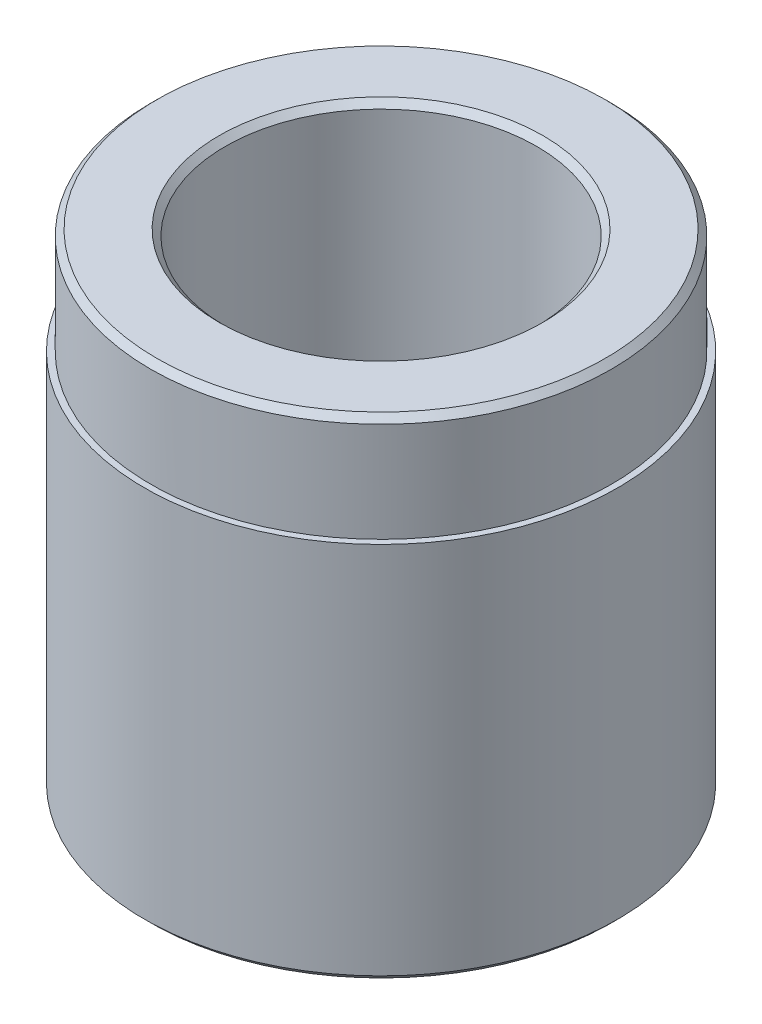
ISO-10303-21;
HEADER;
FILE_DESCRIPTION(('STEP AP214'),'2;1');
FILE_NAME('part.step','',(''),(''),'','','');
FILE_SCHEMA(('AUTOMOTIVE_DESIGN { 1 0 10303 214 1 1 1 1 }'));
ENDSEC;
DATA;
#1=APPLICATION_CONTEXT('core data for automotive mechanical design processes');
#2=APPLICATION_PROTOCOL_DEFINITION('international standard','automotive_design',2000,#1);
#3=PRODUCT_CONTEXT('',#1,'mechanical');
#4=PRODUCT('Part','Part','',(#3));
#5=PRODUCT_RELATED_PRODUCT_CATEGORY('part','',(#4));
#6=PRODUCT_DEFINITION_FORMATION('','',#4);
#7=PRODUCT_DEFINITION_CONTEXT('part definition',#1,'design');
#8=PRODUCT_DEFINITION('design','',#6,#7);
#9=PRODUCT_DEFINITION_SHAPE('','',#8);
#10=(LENGTH_UNIT() NAMED_UNIT(*) SI_UNIT(.MILLI.,.METRE.));
#11=(NAMED_UNIT(*) PLANE_ANGLE_UNIT() SI_UNIT($,.RADIAN.));
#12=(NAMED_UNIT(*) SI_UNIT($,.STERADIAN.) SOLID_ANGLE_UNIT());
#13=UNCERTAINTY_MEASURE_WITH_UNIT(LENGTH_MEASURE(1.E-05),#10,'distance_accuracy_value','');
#14=(GEOMETRIC_REPRESENTATION_CONTEXT(3) GLOBAL_UNCERTAINTY_ASSIGNED_CONTEXT((#13)) GLOBAL_UNIT_ASSIGNED_CONTEXT((#10,
#11,#12)) REPRESENTATION_CONTEXT('',''));
#15=CARTESIAN_POINT('',(0.,0.,0.));
#16=DIRECTION('',(0.,0.,1.));
#17=DIRECTION('',(1.,0.,0.));
#18=AXIS2_PLACEMENT_3D('',#15,#16,#17);
#19=CARTESIAN_POINT('',(37.,61.,0.));
#20=DIRECTION('',(0.,1.,0.));
#21=DIRECTION('',(0.,0.,1.));
#22=AXIS2_PLACEMENT_3D('',#19,#20,#21);
#23=PLANE('',#22);
#24=CARTESIAN_POINT('',(0.,61.,0.));
#25=DIRECTION('',(0.,-1.,0.));
#26=DIRECTION('',(0.,0.,-1.));
#27=AXIS2_PLACEMENT_3D('',#24,#25,#26);
#28=CIRCLE('',#27,37.);
#29=CARTESIAN_POINT('',(0.,61.,-37.));
#30=VERTEX_POINT('',#29);
#31=EDGE_CURVE('E67',#30,#30,#28,.T.);
#32=ORIENTED_EDGE('',*,*,#31,.T.);
#33=EDGE_LOOP('',(#32));
#34=FACE_BOUND('',#33,.T.);
#35=CARTESIAN_POINT('',(0.,61.,0.));
#36=DIRECTION('',(0.,-1.,0.));
#37=DIRECTION('',(0.,0.,-1.));
#38=AXIS2_PLACEMENT_3D('',#35,#36,#37);
#39=CIRCLE('',#38,38.);
#40=CARTESIAN_POINT('',(0.,61.,-38.));
#41=VERTEX_POINT('',#40);
#42=EDGE_CURVE('E64',#41,#41,#39,.T.);
#43=ORIENTED_EDGE('',*,*,#42,.F.);
#44=EDGE_LOOP('',(#43));
#45=FACE_BOUND('',#44,.T.);
#46=ADVANCED_FACE('F32',(#34,#45),#23,.T.);
#47=CARTESIAN_POINT('',(0.,0.,0.));
#48=DIRECTION('',(0.,-1.,0.));
#49=DIRECTION('',(0.,0.,-1.));
#50=AXIS2_PLACEMENT_3D('',#47,#48,#49);
#51=CYLINDRICAL_SURFACE('',#50,38.);
#52=CARTESIAN_POINT('',(0.,1.00000000000001,0.));
#53=DIRECTION('',(0.,-1.,0.));
#54=DIRECTION('',(0.,0.,-1.));
#55=AXIS2_PLACEMENT_3D('',#52,#53,#54);
#56=CIRCLE('',#55,38.);
#57=CARTESIAN_POINT('',(0.,1.00000000000001,-38.));
#58=VERTEX_POINT('',#57);
#59=EDGE_CURVE('E55',#58,#58,#56,.F.);
#60=ORIENTED_EDGE('',*,*,#59,.T.);
#61=EDGE_LOOP('',(#60));
#62=FACE_BOUND('',#61,.T.);
#63=ORIENTED_EDGE('',*,*,#42,.T.);
#64=EDGE_LOOP('',(#63));
#65=FACE_BOUND('',#64,.T.);
#66=ADVANCED_FACE('F88',(#62,#65),#51,.T.);
#67=CARTESIAN_POINT('',(38.,0.,0.));
#68=DIRECTION('',(0.,-1.,0.));
#69=DIRECTION('',(0.,0.,-1.));
#70=AXIS2_PLACEMENT_3D('',#67,#68,#69);
#71=PLANE('',#70);
#72=CARTESIAN_POINT('',(0.,0.,0.));
#73=DIRECTION('',(0.,-1.,0.));
#74=DIRECTION('',(0.,0.,-1.));
#75=AXIS2_PLACEMENT_3D('',#72,#73,#74);
#76=CIRCLE('',#75,37.);
#77=CARTESIAN_POINT('',(0.,0.,-37.));
#78=VERTEX_POINT('',#77);
#79=EDGE_CURVE('E58',#78,#78,#76,.T.);
#80=ORIENTED_EDGE('',*,*,#79,.T.);
#81=EDGE_LOOP('',(#80));
#82=FACE_BOUND('',#81,.T.);
#83=CARTESIAN_POINT('',(0.,0.,0.));
#84=DIRECTION('',(0.,-1.,0.));
#85=DIRECTION('',(0.,0.,-1.));
#86=AXIS2_PLACEMENT_3D('',#83,#84,#85);
#87=CIRCLE('',#86,26.);
#88=CARTESIAN_POINT('',(0.,0.,-26.));
#89=VERTEX_POINT('',#88);
#90=EDGE_CURVE('E61',#89,#89,#87,.F.);
#91=ORIENTED_EDGE('',*,*,#90,.T.);
#92=EDGE_LOOP('',(#91));
#93=FACE_BOUND('',#92,.T.);
#94=ADVANCED_FACE('F93',(#82,#93),#71,.T.);
#95=CARTESIAN_POINT('',(0.,0.,0.));
#96=DIRECTION('',(0.,-1.,0.));
#97=DIRECTION('',(0.,0.,-1.));
#98=AXIS2_PLACEMENT_3D('',#95,#96,#97);
#99=CYLINDRICAL_SURFACE('',#98,25.);
#100=CARTESIAN_POINT('',(0.,0.999999999999997,0.));
#101=DIRECTION('',(0.,-1.,0.));
#102=DIRECTION('',(0.,0.,-1.));
#103=AXIS2_PLACEMENT_3D('',#100,#101,#102);
#104=CIRCLE('',#103,25.);
#105=CARTESIAN_POINT('',(0.,0.999999999999997,-25.));
#106=VERTEX_POINT('',#105);
#107=EDGE_CURVE('E47',#106,#106,#104,.T.);
#108=ORIENTED_EDGE('',*,*,#107,.T.);
#109=EDGE_LOOP('',(#108));
#110=FACE_BOUND('',#109,.T.);
#111=CARTESIAN_POINT('',(0.,77.,0.));
#112=DIRECTION('',(0.,1.,0.));
#113=DIRECTION('',(0.,0.,1.));
#114=AXIS2_PLACEMENT_3D('',#111,#112,#113);
#115=CIRCLE('',#114,25.);
#116=CARTESIAN_POINT('',(0.,77.,25.));
#117=VERTEX_POINT('',#116);
#118=EDGE_CURVE('E52',#117,#117,#115,.T.);
#119=ORIENTED_EDGE('',*,*,#118,.T.);
#120=EDGE_LOOP('',(#119));
#121=FACE_BOUND('',#120,.T.);
#122=ADVANCED_FACE('F85',(#110,#121),#99,.F.);
#123=CARTESIAN_POINT('',(25.,78.,0.));
#124=DIRECTION('',(0.,1.,0.));
#125=DIRECTION('',(0.,0.,1.));
#126=AXIS2_PLACEMENT_3D('',#123,#124,#125);
#127=PLANE('',#126);
#128=CARTESIAN_POINT('',(0.,78.,0.));
#129=DIRECTION('',(0.,1.,0.));
#130=DIRECTION('',(0.,0.,1.));
#131=AXIS2_PLACEMENT_3D('',#128,#129,#130);
#132=CIRCLE('',#131,26.);
#133=CARTESIAN_POINT('',(0.,78.,26.));
#134=VERTEX_POINT('',#133);
#135=EDGE_CURVE('E39',#134,#134,#132,.F.);
#136=ORIENTED_EDGE('',*,*,#135,.T.);
#137=EDGE_LOOP('',(#136));
#138=FACE_BOUND('',#137,.T.);
#139=CARTESIAN_POINT('',(0.,78.,0.));
#140=DIRECTION('',(0.,1.,0.));
#141=DIRECTION('',(0.,0.,1.));
#142=AXIS2_PLACEMENT_3D('',#139,#140,#141);
#143=CIRCLE('',#142,36.);
#144=CARTESIAN_POINT('',(0.,78.,36.));
#145=VERTEX_POINT('',#144);
#146=EDGE_CURVE('E43',#145,#145,#143,.T.);
#147=ORIENTED_EDGE('',*,*,#146,.T.);
#148=EDGE_LOOP('',(#147));
#149=FACE_BOUND('',#148,.T.);
#150=ADVANCED_FACE('F76',(#138,#149),#127,.T.);
#151=CARTESIAN_POINT('',(0.,0.,0.));
#152=DIRECTION('',(0.,-1.,0.));
#153=DIRECTION('',(0.,0.,-1.));
#154=AXIS2_PLACEMENT_3D('',#151,#152,#153);
#155=CYLINDRICAL_SURFACE('',#154,37.);
#156=CARTESIAN_POINT('',(0.,77.,0.));
#157=DIRECTION('',(0.,1.,0.));
#158=DIRECTION('',(0.,0.,1.));
#159=AXIS2_PLACEMENT_3D('',#156,#157,#158);
#160=CIRCLE('',#159,37.);
#161=CARTESIAN_POINT('',(0.,77.,37.));
#162=VERTEX_POINT('',#161);
#163=EDGE_CURVE('E10',#162,#162,#160,.F.);
#164=ORIENTED_EDGE('',*,*,#163,.T.);
#165=EDGE_LOOP('',(#164));
#166=FACE_BOUND('',#165,.T.);
#167=ORIENTED_EDGE('',*,*,#31,.F.);
#168=EDGE_LOOP('',(#167));
#169=FACE_BOUND('',#168,.T.);
#170=ADVANCED_FACE('F73',(#166,#169),#155,.T.);
#171=CARTESIAN_POINT('',(0.,0.,0.));
#172=DIRECTION('',(0.,1.,0.));
#173=DIRECTION('',(0.,0.,1.));
#174=AXIS2_PLACEMENT_3D('',#171,#172,#173);
#175=CONICAL_SURFACE('',#174,37.,0.785398163397438);
#176=ORIENTED_EDGE('',*,*,#59,.F.);
#177=EDGE_LOOP('',(#176));
#178=FACE_BOUND('',#177,.T.);
#179=ORIENTED_EDGE('',*,*,#79,.F.);
#180=EDGE_LOOP('',(#179));
#181=FACE_BOUND('',#180,.T.);
#182=ADVANCED_FACE('F75',(#178,#181),#175,.T.);
#183=CARTESIAN_POINT('',(0.,0.999999999999997,0.));
#184=DIRECTION('',(0.,-1.,0.));
#185=DIRECTION('',(0.,0.,-1.));
#186=AXIS2_PLACEMENT_3D('',#183,#184,#185);
#187=CONICAL_SURFACE('',#186,25.,0.785398163397447);
#188=ORIENTED_EDGE('',*,*,#90,.F.);
#189=EDGE_LOOP('',(#188));
#190=FACE_BOUND('',#189,.T.);
#191=ORIENTED_EDGE('',*,*,#107,.F.);
#192=EDGE_LOOP('',(#191));
#193=FACE_BOUND('',#192,.T.);
#194=ADVANCED_FACE('F82',(#190,#193),#187,.F.);
#195=CARTESIAN_POINT('',(0.,78.,0.));
#196=DIRECTION('',(0.,1.,0.));
#197=DIRECTION('',(0.,0.,1.));
#198=AXIS2_PLACEMENT_3D('',#195,#196,#197);
#199=CONICAL_SURFACE('',#198,26.,0.785398163397445);
#200=ORIENTED_EDGE('',*,*,#118,.F.);
#201=EDGE_LOOP('',(#200));
#202=FACE_BOUND('',#201,.T.);
#203=ORIENTED_EDGE('',*,*,#135,.F.);
#204=EDGE_LOOP('',(#203));
#205=FACE_BOUND('',#204,.T.);
#206=ADVANCED_FACE('F99',(#202,#205),#199,.F.);
#207=CARTESIAN_POINT('',(0.,77.,0.));
#208=DIRECTION('',(0.,-1.,0.));
#209=DIRECTION('',(0.,0.,-1.));
#210=AXIS2_PLACEMENT_3D('',#207,#208,#209);
#211=CONICAL_SURFACE('',#210,37.,0.785398163397441);
#212=ORIENTED_EDGE('',*,*,#146,.F.);
#213=EDGE_LOOP('',(#212));
#214=FACE_BOUND('',#213,.T.);
#215=ORIENTED_EDGE('',*,*,#163,.F.);
#216=EDGE_LOOP('',(#215));
#217=FACE_BOUND('',#216,.T.);
#218=ADVANCED_FACE('F34',(#214,#217),#211,.T.);
#219=CLOSED_SHELL('',(#46,#66,#94,#122,#150,#170,#182,#194,#206,#218));
#220=MANIFOLD_SOLID_BREP('B2',#219);
#221=ADVANCED_BREP_SHAPE_REPRESENTATION('',(#18,#220),#14);
#222=SHAPE_DEFINITION_REPRESENTATION(#9,#221);
ENDSEC;
END-ISO-10303-21;
